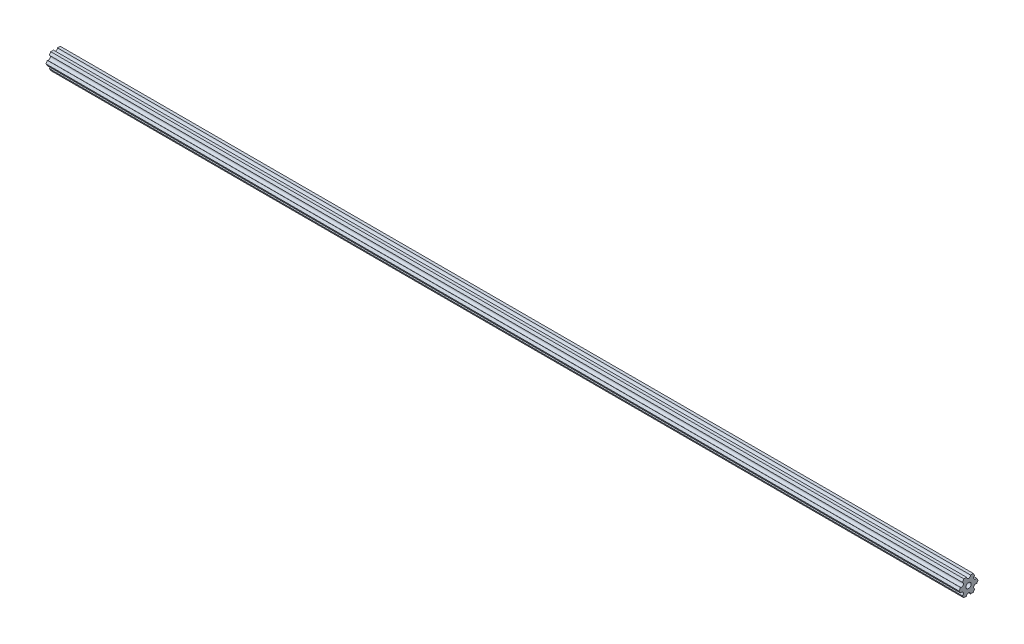
ISO-10303-21;
HEADER;
FILE_DESCRIPTION(('STEP AP214'),'2;1');
FILE_NAME('part.step','',(''),(''),'','','');
FILE_SCHEMA(('AUTOMOTIVE_DESIGN { 1 0 10303 214 1 1 1 1 }'));
ENDSEC;
DATA;
#1=APPLICATION_CONTEXT('core data for automotive mechanical design processes');
#2=APPLICATION_PROTOCOL_DEFINITION('international standard','automotive_design',2000,#1);
#3=PRODUCT_CONTEXT('',#1,'mechanical');
#4=PRODUCT('Part','Part','',(#3));
#5=PRODUCT_RELATED_PRODUCT_CATEGORY('part','',(#4));
#6=PRODUCT_DEFINITION_FORMATION('','',#4);
#7=PRODUCT_DEFINITION_CONTEXT('part definition',#1,'design');
#8=PRODUCT_DEFINITION('design','',#6,#7);
#9=PRODUCT_DEFINITION_SHAPE('','',#8);
#10=(LENGTH_UNIT() NAMED_UNIT(*) SI_UNIT(.MILLI.,.METRE.));
#11=(NAMED_UNIT(*) PLANE_ANGLE_UNIT() SI_UNIT($,.RADIAN.));
#12=(NAMED_UNIT(*) SI_UNIT($,.STERADIAN.) SOLID_ANGLE_UNIT());
#13=UNCERTAINTY_MEASURE_WITH_UNIT(LENGTH_MEASURE(1.E-05),#10,'distance_accuracy_value','');
#14=(GEOMETRIC_REPRESENTATION_CONTEXT(3) GLOBAL_UNCERTAINTY_ASSIGNED_CONTEXT((#13)) GLOBAL_UNIT_ASSIGNED_CONTEXT((#10,
#11,#12)) REPRESENTATION_CONTEXT('',''));
#15=CARTESIAN_POINT('',(0.,0.,0.));
#16=DIRECTION('',(0.,0.,1.));
#17=DIRECTION('',(1.,0.,0.));
#18=AXIS2_PLACEMENT_3D('',#15,#16,#17);
#19=CARTESIAN_POINT('',(714.375,-6.35,-3.66617420935413));
#20=DIRECTION('',(0.,0.5,0.866025403784439));
#21=DIRECTION('',(0.,-0.866025403784439,0.5));
#22=AXIS2_PLACEMENT_3D('',#19,#20,#21);
#23=PLANE('',#22);
#24=DIRECTION('',(0.,0.866025403784439,-0.5));
#25=VECTOR('',#24,1.);
#26=CARTESIAN_POINT('',(708.025,-6.35,-3.66617420935413));
#27=LINE('',#26,#25);
#28=CARTESIAN_POINT('',(708.025,-6.35,-3.66617420935413));
#29=VERTEX_POINT('',#28);
#30=CARTESIAN_POINT('',(708.025,-4.49482271536801,-4.73726131403088));
#31=VERTEX_POINT('',#30);
#32=EDGE_CURVE('E47',#29,#31,#27,.T.);
#33=ORIENTED_EDGE('',*,*,#32,.F.);
#34=DIRECTION('',(-1.,0.,0.));
#35=VECTOR('',#34,1.);
#36=CARTESIAN_POINT('',(714.375,-6.35,-3.66617420935413));
#37=LINE('',#36,#35);
#38=CARTESIAN_POINT('',(0.,-6.35,-3.66617420935413));
#39=VERTEX_POINT('',#38);
#40=EDGE_CURVE('E206',#29,#39,#37,.T.);
#41=ORIENTED_EDGE('',*,*,#40,.T.);
#42=DIRECTION('',(0.,0.866025403784439,-0.5));
#43=VECTOR('',#42,1.);
#44=CARTESIAN_POINT('',(0.,-6.35,-3.66617420935413));
#45=LINE('',#44,#43);
#46=CARTESIAN_POINT('',(0.,-4.49482271536801,-4.73726131403088));
#47=VERTEX_POINT('',#46);
#48=EDGE_CURVE('E228',#39,#47,#45,.T.);
#49=ORIENTED_EDGE('',*,*,#48,.T.);
#50=DIRECTION('',(1.,0.,0.));
#51=VECTOR('',#50,1.);
#52=CARTESIAN_POINT('',(0.,-4.49482271536801,-4.73726131403088));
#53=LINE('',#52,#51);
#54=EDGE_CURVE('E41',#47,#31,#53,.T.);
#55=ORIENTED_EDGE('',*,*,#54,.T.);
#56=EDGE_LOOP('',(#33,#41,#49,#55));
#57=FACE_BOUND('',#56,.T.);
#58=ADVANCED_FACE('F34',(#57),#23,.F.);
#59=CARTESIAN_POINT('',(714.375,0.,-7.33234841870825));
#60=DIRECTION('',(0.,-0.5,0.866025403784439));
#61=DIRECTION('',(0.,-0.866025403784439,-0.5));
#62=AXIS2_PLACEMENT_3D('',#59,#60,#61);
#63=PLANE('',#62);
#64=DIRECTION('',(0.,0.866025403784439,0.5));
#65=VECTOR('',#64,1.);
#66=CARTESIAN_POINT('',(708.025,0.,-7.33234841870825));
#67=LINE('',#66,#65);
#68=CARTESIAN_POINT('',(708.025,0.,-7.33234841870825));
#69=VERTEX_POINT('',#68);
#70=CARTESIAN_POINT('',(708.025,1.85517728463229,-6.26126131403132));
#71=VERTEX_POINT('',#70);
#72=EDGE_CURVE('E164',#69,#71,#67,.T.);
#73=ORIENTED_EDGE('',*,*,#72,.F.);
#74=DIRECTION('',(-1.,0.,0.));
#75=VECTOR('',#74,1.);
#76=CARTESIAN_POINT('',(714.375,0.,-7.33234841870825));
#77=LINE('',#76,#75);
#78=CARTESIAN_POINT('',(0.,0.,-7.33234841870825));
#79=VERTEX_POINT('',#78);
#80=EDGE_CURVE('E163',#69,#79,#77,.T.);
#81=ORIENTED_EDGE('',*,*,#80,.T.);
#82=DIRECTION('',(0.,0.866025403784439,0.5));
#83=VECTOR('',#82,1.);
#84=CARTESIAN_POINT('',(0.,0.,-7.33234841870825));
#85=LINE('',#84,#83);
#86=CARTESIAN_POINT('',(0.,1.85517728463229,-6.26126131403132));
#87=VERTEX_POINT('',#86);
#88=EDGE_CURVE('E224',#79,#87,#85,.T.);
#89=ORIENTED_EDGE('',*,*,#88,.T.);
#90=DIRECTION('',(1.,0.,0.));
#91=VECTOR('',#90,1.);
#92=CARTESIAN_POINT('',(0.,1.85517728463229,-6.26126131403132));
#93=LINE('',#92,#91);
#94=EDGE_CURVE('E170',#87,#71,#93,.T.);
#95=ORIENTED_EDGE('',*,*,#94,.T.);
#96=EDGE_LOOP('',(#73,#81,#89,#95));
#97=FACE_BOUND('',#96,.T.);
#98=ADVANCED_FACE('F290',(#97),#63,.F.);
#99=CARTESIAN_POINT('',(714.375,6.35,-3.66617420935412));
#100=DIRECTION('',(0.,-1.,0.));
#101=DIRECTION('',(0.,0.,-1.));
#102=AXIS2_PLACEMENT_3D('',#99,#100,#101);
#103=PLANE('',#102);
#104=DIRECTION('',(0.,0.,1.));
#105=VECTOR('',#104,1.);
#106=CARTESIAN_POINT('',(708.025,6.35,-3.66617420935412));
#107=LINE('',#106,#105);
#108=CARTESIAN_POINT('',(708.025,6.35,-3.66617420935412));
#109=VERTEX_POINT('',#108);
#110=CARTESIAN_POINT('',(708.025,6.35,-1.524));
#111=VERTEX_POINT('',#110);
#112=EDGE_CURVE('E274',#109,#111,#107,.T.);
#113=ORIENTED_EDGE('',*,*,#112,.F.);
#114=DIRECTION('',(-1.,0.,0.));
#115=VECTOR('',#114,1.);
#116=CARTESIAN_POINT('',(714.375,6.35,-3.66617420935412));
#117=LINE('',#116,#115);
#118=CARTESIAN_POINT('',(0.,6.35,-3.66617420935412));
#119=VERTEX_POINT('',#118);
#120=EDGE_CURVE('E198',#109,#119,#117,.T.);
#121=ORIENTED_EDGE('',*,*,#120,.T.);
#122=DIRECTION('',(0.,0.,1.));
#123=VECTOR('',#122,1.);
#124=CARTESIAN_POINT('',(0.,6.35,-3.66617420935412));
#125=LINE('',#124,#123);
#126=CARTESIAN_POINT('',(0.,6.35,-1.524));
#127=VERTEX_POINT('',#126);
#128=EDGE_CURVE('E220',#119,#127,#125,.T.);
#129=ORIENTED_EDGE('',*,*,#128,.T.);
#130=DIRECTION('',(1.,0.,0.));
#131=VECTOR('',#130,1.);
#132=CARTESIAN_POINT('',(0.,6.35,-1.524));
#133=LINE('',#132,#131);
#134=EDGE_CURVE('E177',#127,#111,#133,.T.);
#135=ORIENTED_EDGE('',*,*,#134,.T.);
#136=EDGE_LOOP('',(#113,#121,#129,#135));
#137=FACE_BOUND('',#136,.T.);
#138=ADVANCED_FACE('F305',(#137),#103,.F.);
#139=CARTESIAN_POINT('',(714.375,6.35,3.66617420935412));
#140=DIRECTION('',(0.,-0.5,-0.866025403784439));
#141=DIRECTION('',(0.,0.866025403784439,-0.5));
#142=AXIS2_PLACEMENT_3D('',#139,#140,#141);
#143=PLANE('',#142);
#144=DIRECTION('',(0.,-0.866025403784439,0.5));
#145=VECTOR('',#144,1.);
#146=CARTESIAN_POINT('',(708.025,6.35,3.66617420935412));
#147=LINE('',#146,#145);
#148=CARTESIAN_POINT('',(708.025,6.35,3.66617420935412));
#149=VERTEX_POINT('',#148);
#150=CARTESIAN_POINT('',(708.025,4.49482271536755,4.73726131403115));
#151=VERTEX_POINT('',#150);
#152=EDGE_CURVE('E264',#149,#151,#147,.T.);
#153=ORIENTED_EDGE('',*,*,#152,.F.);
#154=DIRECTION('',(-1.,0.,0.));
#155=VECTOR('',#154,1.);
#156=CARTESIAN_POINT('',(714.375,6.35,3.66617420935412));
#157=LINE('',#156,#155);
#158=CARTESIAN_POINT('',(0.,6.35,3.66617420935412));
#159=VERTEX_POINT('',#158);
#160=EDGE_CURVE('E200',#149,#159,#157,.T.);
#161=ORIENTED_EDGE('',*,*,#160,.T.);
#162=DIRECTION('',(0.,-0.866025403784439,0.5));
#163=VECTOR('',#162,1.);
#164=CARTESIAN_POINT('',(0.,6.35,3.66617420935412));
#165=LINE('',#164,#163);
#166=CARTESIAN_POINT('',(0.,4.49482271536755,4.73726131403115));
#167=VERTEX_POINT('',#166);
#168=EDGE_CURVE('E216',#159,#167,#165,.T.);
#169=ORIENTED_EDGE('',*,*,#168,.T.);
#170=DIRECTION('',(1.,0.,0.));
#171=VECTOR('',#170,1.);
#172=CARTESIAN_POINT('',(0.,4.49482271536755,4.73726131403115));
#173=LINE('',#172,#171);
#174=EDGE_CURVE('E182',#167,#151,#173,.T.);
#175=ORIENTED_EDGE('',*,*,#174,.T.);
#176=EDGE_LOOP('',(#153,#161,#169,#175));
#177=FACE_BOUND('',#176,.T.);
#178=ADVANCED_FACE('F319',(#177),#143,.F.);
#179=CARTESIAN_POINT('',(714.375,0.,7.33234841870825));
#180=DIRECTION('',(0.,0.5,-0.866025403784439));
#181=DIRECTION('',(0.,0.866025403784439,0.5));
#182=AXIS2_PLACEMENT_3D('',#179,#180,#181);
#183=PLANE('',#182);
#184=DIRECTION('',(0.,-0.866025403784439,-0.5));
#185=VECTOR('',#184,1.);
#186=CARTESIAN_POINT('',(708.025,0.,7.33234841870825));
#187=LINE('',#186,#185);
#188=CARTESIAN_POINT('',(708.025,0.,7.33234841870825));
#189=VERTEX_POINT('',#188);
#190=CARTESIAN_POINT('',(708.025,-1.85517728463215,6.2612613140314));
#191=VERTEX_POINT('',#190);
#192=EDGE_CURVE('E256',#189,#191,#187,.T.);
#193=ORIENTED_EDGE('',*,*,#192,.F.);
#194=DIRECTION('',(-1.,0.,0.));
#195=VECTOR('',#194,1.);
#196=CARTESIAN_POINT('',(714.375,0.,7.33234841870825));
#197=LINE('',#196,#195);
#198=CARTESIAN_POINT('',(0.,0.,7.33234841870825));
#199=VERTEX_POINT('',#198);
#200=EDGE_CURVE('E202',#189,#199,#197,.T.);
#201=ORIENTED_EDGE('',*,*,#200,.T.);
#202=DIRECTION('',(0.,-0.866025403784439,-0.5));
#203=VECTOR('',#202,1.);
#204=CARTESIAN_POINT('',(0.,0.,7.33234841870825));
#205=LINE('',#204,#203);
#206=CARTESIAN_POINT('',(0.,-1.85517728463215,6.2612613140314));
#207=VERTEX_POINT('',#206);
#208=EDGE_CURVE('E212',#199,#207,#205,.T.);
#209=ORIENTED_EDGE('',*,*,#208,.T.);
#210=DIRECTION('',(1.,0.,0.));
#211=VECTOR('',#210,1.);
#212=CARTESIAN_POINT('',(0.,-1.85517728463215,6.2612613140314));
#213=LINE('',#212,#211);
#214=EDGE_CURVE('E187',#207,#191,#213,.T.);
#215=ORIENTED_EDGE('',*,*,#214,.T.);
#216=EDGE_LOOP('',(#193,#201,#209,#215));
#217=FACE_BOUND('',#216,.T.);
#218=ADVANCED_FACE('F334',(#217),#183,.F.);
#219=CARTESIAN_POINT('',(714.375,-6.35,3.66617420935413));
#220=DIRECTION('',(0.,1.,0.));
#221=DIRECTION('',(0.,0.,1.));
#222=AXIS2_PLACEMENT_3D('',#219,#220,#221);
#223=PLANE('',#222);
#224=DIRECTION('',(0.,0.,-1.));
#225=VECTOR('',#224,1.);
#226=CARTESIAN_POINT('',(708.025,-6.35,3.66617420935413));
#227=LINE('',#226,#225);
#228=CARTESIAN_POINT('',(708.025,-6.35,3.66617420935413));
#229=VERTEX_POINT('',#228);
#230=CARTESIAN_POINT('',(708.025,-6.35,1.52400000000069));
#231=VERTEX_POINT('',#230);
#232=EDGE_CURVE('E266',#229,#231,#227,.T.);
#233=ORIENTED_EDGE('',*,*,#232,.F.);
#234=DIRECTION('',(-1.,0.,0.));
#235=VECTOR('',#234,1.);
#236=CARTESIAN_POINT('',(714.375,-6.35,3.66617420935413));
#237=LINE('',#236,#235);
#238=CARTESIAN_POINT('',(0.,-6.35,3.66617420935413));
#239=VERTEX_POINT('',#238);
#240=EDGE_CURVE('E204',#229,#239,#237,.T.);
#241=ORIENTED_EDGE('',*,*,#240,.T.);
#242=DIRECTION('',(0.,0.,-1.));
#243=VECTOR('',#242,1.);
#244=CARTESIAN_POINT('',(0.,-6.35,3.66617420935413));
#245=LINE('',#244,#243);
#246=CARTESIAN_POINT('',(0.,-6.35,1.52400000000069));
#247=VERTEX_POINT('',#246);
#248=EDGE_CURVE('E208',#239,#247,#245,.T.);
#249=ORIENTED_EDGE('',*,*,#248,.T.);
#250=DIRECTION('',(1.,0.,0.));
#251=VECTOR('',#250,1.);
#252=CARTESIAN_POINT('',(0.,-6.35,1.52400000000069));
#253=LINE('',#252,#251);
#254=EDGE_CURVE('E192',#247,#231,#253,.T.);
#255=ORIENTED_EDGE('',*,*,#254,.T.);
#256=EDGE_LOOP('',(#233,#241,#249,#255));
#257=FACE_BOUND('',#256,.T.);
#258=ADVANCED_FACE('F349',(#257),#223,.F.);
#259=DIRECTION('',(0.,0.866025403784439,-0.5));
#260=VECTOR('',#259,1.);
#261=CARTESIAN_POINT('',(708.025,-6.35,-3.66617420935413));
#262=LINE('',#261,#260);
#263=CARTESIAN_POINT('',(708.025,-1.85517728463199,-6.26126131403149));
#264=VERTEX_POINT('',#263);
#265=EDGE_CURVE('E157',#264,#69,#262,.T.);
#266=ORIENTED_EDGE('',*,*,#265,.F.);
#267=DIRECTION('',(1.,0.,0.));
#268=VECTOR('',#267,1.);
#269=CARTESIAN_POINT('',(0.,-1.85517728463199,-6.26126131403149));
#270=LINE('',#269,#268);
#271=CARTESIAN_POINT('',(0.,-1.85517728463199,-6.26126131403149));
#272=VERTEX_POINT('',#271);
#273=EDGE_CURVE('E55',#264,#272,#270,.F.);
#274=ORIENTED_EDGE('',*,*,#273,.T.);
#275=EDGE_CURVE('E231',#272,#79,#45,.T.);
#276=ORIENTED_EDGE('',*,*,#275,.T.);
#277=ORIENTED_EDGE('',*,*,#80,.F.);
#278=EDGE_LOOP('',(#266,#274,#276,#277));
#279=FACE_BOUND('',#278,.T.);
#280=ADVANCED_FACE('F162',(#279),#23,.F.);
#281=DIRECTION('',(0.,0.866025403784439,0.5));
#282=VECTOR('',#281,1.);
#283=CARTESIAN_POINT('',(708.025,0.,-7.33234841870825));
#284=LINE('',#283,#282);
#285=CARTESIAN_POINT('',(708.025,4.49482271536771,-4.73726131403105));
#286=VERTEX_POINT('',#285);
#287=EDGE_CURVE('E276',#286,#109,#284,.T.);
#288=ORIENTED_EDGE('',*,*,#287,.F.);
#289=DIRECTION('',(1.,0.,0.));
#290=VECTOR('',#289,1.);
#291=CARTESIAN_POINT('',(0.,4.49482271536771,-4.73726131403105));
#292=LINE('',#291,#290);
#293=CARTESIAN_POINT('',(0.,4.49482271536771,-4.73726131403105));
#294=VERTEX_POINT('',#293);
#295=EDGE_CURVE('E173',#286,#294,#292,.F.);
#296=ORIENTED_EDGE('',*,*,#295,.T.);
#297=EDGE_CURVE('E227',#294,#119,#85,.T.);
#298=ORIENTED_EDGE('',*,*,#297,.T.);
#299=ORIENTED_EDGE('',*,*,#120,.F.);
#300=EDGE_LOOP('',(#288,#296,#298,#299));
#301=FACE_BOUND('',#300,.T.);
#302=ADVANCED_FACE('F301',(#301),#63,.F.);
#303=DIRECTION('',(0.,0.,1.));
#304=VECTOR('',#303,1.);
#305=CARTESIAN_POINT('',(708.025,6.35,-3.66617420935412));
#306=LINE('',#305,#304);
#307=CARTESIAN_POINT('',(708.025,6.35,1.524));
#308=VERTEX_POINT('',#307);
#309=EDGE_CURVE('E268',#308,#149,#306,.T.);
#310=ORIENTED_EDGE('',*,*,#309,.F.);
#311=DIRECTION('',(1.,0.,0.));
#312=VECTOR('',#311,1.);
#313=CARTESIAN_POINT('',(0.,6.35,1.524));
#314=LINE('',#313,#312);
#315=CARTESIAN_POINT('',(0.,6.35,1.524));
#316=VERTEX_POINT('',#315);
#317=EDGE_CURVE('E180',#308,#316,#314,.F.);
#318=ORIENTED_EDGE('',*,*,#317,.T.);
#319=EDGE_CURVE('E223',#316,#159,#125,.T.);
#320=ORIENTED_EDGE('',*,*,#319,.T.);
#321=ORIENTED_EDGE('',*,*,#160,.F.);
#322=EDGE_LOOP('',(#310,#318,#320,#321));
#323=FACE_BOUND('',#322,.T.);
#324=ADVANCED_FACE('F315',(#323),#103,.F.);
#325=DIRECTION('',(0.,-0.866025403784439,0.5));
#326=VECTOR('',#325,1.);
#327=CARTESIAN_POINT('',(708.025,6.35,3.66617420935412));
#328=LINE('',#327,#326);
#329=CARTESIAN_POINT('',(708.025,1.85517728463244,6.26126131403123));
#330=VERTEX_POINT('',#329);
#331=EDGE_CURVE('E258',#330,#189,#328,.T.);
#332=ORIENTED_EDGE('',*,*,#331,.F.);
#333=DIRECTION('',(1.,0.,0.));
#334=VECTOR('',#333,1.);
#335=CARTESIAN_POINT('',(0.,1.85517728463244,6.26126131403123));
#336=LINE('',#335,#334);
#337=CARTESIAN_POINT('',(0.,1.85517728463244,6.26126131403123));
#338=VERTEX_POINT('',#337);
#339=EDGE_CURVE('E185',#330,#338,#336,.F.);
#340=ORIENTED_EDGE('',*,*,#339,.T.);
#341=EDGE_CURVE('E219',#338,#199,#165,.T.);
#342=ORIENTED_EDGE('',*,*,#341,.T.);
#343=ORIENTED_EDGE('',*,*,#200,.F.);
#344=EDGE_LOOP('',(#332,#340,#342,#343));
#345=FACE_BOUND('',#344,.T.);
#346=ADVANCED_FACE('F330',(#345),#143,.F.);
#347=DIRECTION('',(0.,-0.866025403784439,-0.5));
#348=VECTOR('',#347,1.);
#349=CARTESIAN_POINT('',(708.025,0.,7.33234841870825));
#350=LINE('',#349,#348);
#351=CARTESIAN_POINT('',(708.025,-4.49482271536786,4.73726131403097));
#352=VERTEX_POINT('',#351);
#353=EDGE_CURVE('E260',#352,#229,#350,.T.);
#354=ORIENTED_EDGE('',*,*,#353,.F.);
#355=DIRECTION('',(1.,0.,0.));
#356=VECTOR('',#355,1.);
#357=CARTESIAN_POINT('',(0.,-4.49482271536786,4.73726131403097));
#358=LINE('',#357,#356);
#359=CARTESIAN_POINT('',(0.,-4.49482271536786,4.73726131403097));
#360=VERTEX_POINT('',#359);
#361=EDGE_CURVE('E190',#352,#360,#358,.F.);
#362=ORIENTED_EDGE('',*,*,#361,.T.);
#363=EDGE_CURVE('E215',#360,#239,#205,.T.);
#364=ORIENTED_EDGE('',*,*,#363,.T.);
#365=ORIENTED_EDGE('',*,*,#240,.F.);
#366=EDGE_LOOP('',(#354,#362,#364,#365));
#367=FACE_BOUND('',#366,.T.);
#368=ADVANCED_FACE('F345',(#367),#183,.F.);
#369=DIRECTION('',(0.,0.,-1.));
#370=VECTOR('',#369,1.);
#371=CARTESIAN_POINT('',(708.025,-6.35,3.66617420935413));
#372=LINE('',#371,#370);
#373=CARTESIAN_POINT('',(708.025,-6.35,-1.52400000000069));
#374=VERTEX_POINT('',#373);
#375=EDGE_CURVE('E278',#374,#29,#372,.T.);
#376=ORIENTED_EDGE('',*,*,#375,.F.);
#377=DIRECTION('',(1.,0.,0.));
#378=VECTOR('',#377,1.);
#379=CARTESIAN_POINT('',(0.,-6.35,-1.52400000000069));
#380=LINE('',#379,#378);
#381=CARTESIAN_POINT('',(0.,-6.35,-1.52400000000069));
#382=VERTEX_POINT('',#381);
#383=EDGE_CURVE('E195',#374,#382,#380,.F.);
#384=ORIENTED_EDGE('',*,*,#383,.T.);
#385=EDGE_CURVE('E211',#382,#39,#245,.T.);
#386=ORIENTED_EDGE('',*,*,#385,.T.);
#387=ORIENTED_EDGE('',*,*,#40,.F.);
#388=EDGE_LOOP('',(#376,#384,#386,#387));
#389=FACE_BOUND('',#388,.T.);
#390=ADVANCED_FACE('F360',(#389),#223,.F.);
#391=CARTESIAN_POINT('',(714.375,0.,0.));
#392=DIRECTION('',(-1.,0.,0.));
#393=DIRECTION('',(0.,0.,1.));
#394=AXIS2_PLACEMENT_3D('',#391,#392,#393);
#395=CYLINDRICAL_SURFACE('',#394,2.0193);
#396=CARTESIAN_POINT('',(0.,0.,0.));
#397=DIRECTION('',(1.,0.,0.));
#398=DIRECTION('',(0.,0.,-1.));
#399=AXIS2_PLACEMENT_3D('',#396,#397,#398);
#400=CIRCLE('',#399,2.0193);
#401=CARTESIAN_POINT('',(0.,0.,-2.0193));
#402=VERTEX_POINT('',#401);
#403=EDGE_CURVE('E232',#402,#402,#400,.T.);
#404=ORIENTED_EDGE('',*,*,#403,.F.);
#405=EDGE_LOOP('',(#404));
#406=FACE_BOUND('',#405,.T.);
#407=CARTESIAN_POINT('',(708.025,0.,0.));
#408=DIRECTION('',(1.,0.,0.));
#409=DIRECTION('',(0.,0.,-1.));
#410=AXIS2_PLACEMENT_3D('',#407,#408,#409);
#411=CIRCLE('',#410,2.0193);
#412=CARTESIAN_POINT('',(708.025,0.,-2.0193));
#413=VERTEX_POINT('',#412);
#414=EDGE_CURVE('E249',#413,#413,#411,.T.);
#415=ORIENTED_EDGE('',*,*,#414,.T.);
#416=EDGE_LOOP('',(#415));
#417=FACE_BOUND('',#416,.T.);
#418=ADVANCED_FACE('F379',(#406,#417),#395,.F.);
#419=CARTESIAN_POINT('',(0.,-6.35,0.));
#420=DIRECTION('',(1.,0.,0.));
#421=DIRECTION('',(0.,0.,-1.));
#422=AXIS2_PLACEMENT_3D('',#419,#420,#421);
#423=CYLINDRICAL_SURFACE('',#422,1.52400000000069);
#424=CARTESIAN_POINT('',(708.025,-6.35,0.));
#425=DIRECTION('',(1.,0.,0.));
#426=DIRECTION('',(0.,0.,-1.));
#427=AXIS2_PLACEMENT_3D('',#424,#425,#426);
#428=CIRCLE('',#427,1.52400000000069);
#429=EDGE_CURVE('E270',#231,#374,#428,.F.);
#430=ORIENTED_EDGE('',*,*,#429,.F.);
#431=ORIENTED_EDGE('',*,*,#254,.F.);
#432=CARTESIAN_POINT('',(0.,-6.35,0.));
#433=DIRECTION('',(1.,0.,0.));
#434=DIRECTION('',(0.,0.,-1.));
#435=AXIS2_PLACEMENT_3D('',#432,#433,#434);
#436=CIRCLE('',#435,1.52400000000069);
#437=EDGE_CURVE('E239',#382,#247,#436,.T.);
#438=ORIENTED_EDGE('',*,*,#437,.F.);
#439=ORIENTED_EDGE('',*,*,#383,.F.);
#440=EDGE_LOOP('',(#430,#431,#438,#439));
#441=FACE_BOUND('',#440,.T.);
#442=ADVANCED_FACE('F352',(#441),#423,.F.);
#443=CARTESIAN_POINT('',(0.,-3.175,5.49926131403119));
#444=DIRECTION('',(1.,0.,0.));
#445=DIRECTION('',(0.,0.,-1.));
#446=AXIS2_PLACEMENT_3D('',#443,#444,#445);
#447=CYLINDRICAL_SURFACE('',#446,1.52400000000042);
#448=CARTESIAN_POINT('',(708.025,-3.175,5.49926131403119));
#449=DIRECTION('',(1.,0.,0.));
#450=DIRECTION('',(0.,0.,-1.));
#451=AXIS2_PLACEMENT_3D('',#448,#449,#450);
#452=CIRCLE('',#451,1.52400000000042);
#453=EDGE_CURVE('E254',#191,#352,#452,.F.);
#454=ORIENTED_EDGE('',*,*,#453,.F.);
#455=ORIENTED_EDGE('',*,*,#214,.F.);
#456=CARTESIAN_POINT('',(0.,-3.175,5.49926131403119));
#457=DIRECTION('',(1.,0.,0.));
#458=DIRECTION('',(0.,0.,-1.));
#459=AXIS2_PLACEMENT_3D('',#456,#457,#458);
#460=CIRCLE('',#459,1.52400000000042);
#461=EDGE_CURVE('E236',#360,#207,#460,.T.);
#462=ORIENTED_EDGE('',*,*,#461,.F.);
#463=ORIENTED_EDGE('',*,*,#361,.F.);
#464=EDGE_LOOP('',(#454,#455,#462,#463));
#465=FACE_BOUND('',#464,.T.);
#466=ADVANCED_FACE('F337',(#465),#447,.F.);
#467=CARTESIAN_POINT('',(0.,3.175,5.49926131403119));
#468=DIRECTION('',(1.,0.,0.));
#469=DIRECTION('',(0.,0.,-1.));
#470=AXIS2_PLACEMENT_3D('',#467,#468,#469);
#471=CYLINDRICAL_SURFACE('',#470,1.52400000000008);
#472=CARTESIAN_POINT('',(708.025,3.175,5.49926131403119));
#473=DIRECTION('',(1.,0.,0.));
#474=DIRECTION('',(0.,0.,-1.));
#475=AXIS2_PLACEMENT_3D('',#472,#473,#474);
#476=CIRCLE('',#475,1.52400000000008);
#477=EDGE_CURVE('E262',#151,#330,#476,.F.);
#478=ORIENTED_EDGE('',*,*,#477,.F.);
#479=ORIENTED_EDGE('',*,*,#174,.F.);
#480=CARTESIAN_POINT('',(0.,3.175,5.49926131403119));
#481=DIRECTION('',(1.,0.,0.));
#482=DIRECTION('',(0.,0.,-1.));
#483=AXIS2_PLACEMENT_3D('',#480,#481,#482);
#484=CIRCLE('',#483,1.52400000000008);
#485=EDGE_CURVE('E240',#338,#167,#484,.T.);
#486=ORIENTED_EDGE('',*,*,#485,.F.);
#487=ORIENTED_EDGE('',*,*,#339,.F.);
#488=EDGE_LOOP('',(#478,#479,#486,#487));
#489=FACE_BOUND('',#488,.T.);
#490=ADVANCED_FACE('F322',(#489),#471,.F.);
#491=CARTESIAN_POINT('',(0.,6.35,0.));
#492=DIRECTION('',(1.,0.,0.));
#493=DIRECTION('',(0.,0.,-1.));
#494=AXIS2_PLACEMENT_3D('',#491,#492,#493);
#495=CYLINDRICAL_SURFACE('',#494,1.524);
#496=CARTESIAN_POINT('',(708.025,6.35,0.));
#497=DIRECTION('',(1.,0.,0.));
#498=DIRECTION('',(0.,0.,-1.));
#499=AXIS2_PLACEMENT_3D('',#496,#497,#498);
#500=CIRCLE('',#499,1.524);
#501=EDGE_CURVE('E272',#111,#308,#500,.F.);
#502=ORIENTED_EDGE('',*,*,#501,.F.);
#503=ORIENTED_EDGE('',*,*,#134,.F.);
#504=CARTESIAN_POINT('',(0.,6.35,0.));
#505=DIRECTION('',(1.,0.,0.));
#506=DIRECTION('',(0.,0.,-1.));
#507=AXIS2_PLACEMENT_3D('',#504,#505,#506);
#508=CIRCLE('',#507,1.524);
#509=EDGE_CURVE('E235',#316,#127,#508,.T.);
#510=ORIENTED_EDGE('',*,*,#509,.F.);
#511=ORIENTED_EDGE('',*,*,#317,.F.);
#512=EDGE_LOOP('',(#502,#503,#510,#511));
#513=FACE_BOUND('',#512,.T.);
#514=ADVANCED_FACE('F308',(#513),#495,.F.);
#515=CARTESIAN_POINT('',(0.,3.175,-5.49926131403119));
#516=DIRECTION('',(1.,0.,0.));
#517=DIRECTION('',(0.,0.,-1.));
#518=AXIS2_PLACEMENT_3D('',#515,#516,#517);
#519=CYLINDRICAL_SURFACE('',#518,1.52400000000026);
#520=CARTESIAN_POINT('',(708.025,3.175,-5.49926131403119));
#521=DIRECTION('',(1.,0.,0.));
#522=DIRECTION('',(0.,0.,-1.));
#523=AXIS2_PLACEMENT_3D('',#520,#521,#522);
#524=CIRCLE('',#523,1.52400000000026);
#525=EDGE_CURVE('E280',#71,#286,#524,.F.);
#526=ORIENTED_EDGE('',*,*,#525,.F.);
#527=ORIENTED_EDGE('',*,*,#94,.F.);
#528=CARTESIAN_POINT('',(0.,3.175,-5.49926131403119));
#529=DIRECTION('',(1.,0.,0.));
#530=DIRECTION('',(0.,0.,-1.));
#531=AXIS2_PLACEMENT_3D('',#528,#529,#530);
#532=CIRCLE('',#531,1.52400000000026);
#533=EDGE_CURVE('E244',#294,#87,#532,.T.);
#534=ORIENTED_EDGE('',*,*,#533,.F.);
#535=ORIENTED_EDGE('',*,*,#295,.F.);
#536=EDGE_LOOP('',(#526,#527,#534,#535));
#537=FACE_BOUND('',#536,.T.);
#538=ADVANCED_FACE('F288',(#537),#519,.F.);
#539=CARTESIAN_POINT('',(0.,-3.175,-5.49926131403119));
#540=DIRECTION('',(1.,0.,0.));
#541=DIRECTION('',(0.,0.,-1.));
#542=AXIS2_PLACEMENT_3D('',#539,#540,#541);
#543=CYLINDRICAL_SURFACE('',#542,1.52400000000061);
#544=CARTESIAN_POINT('',(708.025,-3.175,-5.49926131403119));
#545=DIRECTION('',(1.,0.,0.));
#546=DIRECTION('',(0.,0.,-1.));
#547=AXIS2_PLACEMENT_3D('',#544,#545,#546);
#548=CIRCLE('',#547,1.52400000000061);
#549=EDGE_CURVE('E11',#31,#264,#548,.F.);
#550=ORIENTED_EDGE('',*,*,#549,.F.);
#551=ORIENTED_EDGE('',*,*,#54,.F.);
#552=CARTESIAN_POINT('',(0.,-3.175,-5.49926131403119));
#553=DIRECTION('',(1.,0.,0.));
#554=DIRECTION('',(0.,0.,-1.));
#555=AXIS2_PLACEMENT_3D('',#552,#553,#554);
#556=CIRCLE('',#555,1.52400000000061);
#557=EDGE_CURVE('E168',#272,#47,#556,.T.);
#558=ORIENTED_EDGE('',*,*,#557,.F.);
#559=ORIENTED_EDGE('',*,*,#273,.F.);
#560=EDGE_LOOP('',(#550,#551,#558,#559));
#561=FACE_BOUND('',#560,.T.);
#562=ADVANCED_FACE('F166',(#561),#543,.F.);
#563=CARTESIAN_POINT('',(0.,0.,0.));
#564=DIRECTION('',(1.,0.,0.));
#565=DIRECTION('',(0.,0.,-1.));
#566=AXIS2_PLACEMENT_3D('',#563,#564,#565);
#567=PLANE('',#566);
#568=ORIENTED_EDGE('',*,*,#319,.F.);
#569=ORIENTED_EDGE('',*,*,#509,.T.);
#570=ORIENTED_EDGE('',*,*,#128,.F.);
#571=ORIENTED_EDGE('',*,*,#297,.F.);
#572=ORIENTED_EDGE('',*,*,#533,.T.);
#573=ORIENTED_EDGE('',*,*,#88,.F.);
#574=ORIENTED_EDGE('',*,*,#275,.F.);
#575=ORIENTED_EDGE('',*,*,#557,.T.);
#576=ORIENTED_EDGE('',*,*,#48,.F.);
#577=ORIENTED_EDGE('',*,*,#385,.F.);
#578=ORIENTED_EDGE('',*,*,#437,.T.);
#579=ORIENTED_EDGE('',*,*,#248,.F.);
#580=ORIENTED_EDGE('',*,*,#363,.F.);
#581=ORIENTED_EDGE('',*,*,#461,.T.);
#582=ORIENTED_EDGE('',*,*,#208,.F.);
#583=ORIENTED_EDGE('',*,*,#341,.F.);
#584=ORIENTED_EDGE('',*,*,#485,.T.);
#585=ORIENTED_EDGE('',*,*,#168,.F.);
#586=EDGE_LOOP('',(#568,#569,#570,#571,#572,#573,#574,#575,#576,#577,#578,#579,#580,#581,#582,
#583,#584,#585));
#587=FACE_BOUND('',#586,.T.);
#588=ORIENTED_EDGE('',*,*,#403,.T.);
#589=EDGE_LOOP('',(#588));
#590=FACE_BOUND('',#589,.T.);
#591=ADVANCED_FACE('F294',(#587,#590),#567,.F.);
#592=CARTESIAN_POINT('',(708.025,0.,0.));
#593=DIRECTION('',(1.,0.,0.));
#594=DIRECTION('',(0.,0.,-1.));
#595=AXIS2_PLACEMENT_3D('',#592,#593,#594);
#596=PLANE('',#595);
#597=ORIENTED_EDGE('',*,*,#414,.F.);
#598=EDGE_LOOP('',(#597));
#599=FACE_BOUND('',#598,.T.);
#600=ORIENTED_EDGE('',*,*,#453,.T.);
#601=ORIENTED_EDGE('',*,*,#353,.T.);
#602=ORIENTED_EDGE('',*,*,#232,.T.);
#603=ORIENTED_EDGE('',*,*,#429,.T.);
#604=ORIENTED_EDGE('',*,*,#375,.T.);
#605=ORIENTED_EDGE('',*,*,#32,.T.);
#606=ORIENTED_EDGE('',*,*,#549,.T.);
#607=ORIENTED_EDGE('',*,*,#265,.T.);
#608=ORIENTED_EDGE('',*,*,#72,.T.);
#609=ORIENTED_EDGE('',*,*,#525,.T.);
#610=ORIENTED_EDGE('',*,*,#287,.T.);
#611=ORIENTED_EDGE('',*,*,#112,.T.);
#612=ORIENTED_EDGE('',*,*,#501,.T.);
#613=ORIENTED_EDGE('',*,*,#309,.T.);
#614=ORIENTED_EDGE('',*,*,#152,.T.);
#615=ORIENTED_EDGE('',*,*,#477,.T.);
#616=ORIENTED_EDGE('',*,*,#331,.T.);
#617=ORIENTED_EDGE('',*,*,#192,.T.);
#618=EDGE_LOOP('',(#600,#601,#602,#603,#604,#605,#606,#607,#608,#609,#610,#611,#612,#613,#614,
#615,#616,#617));
#619=FACE_BOUND('',#618,.T.);
#620=ADVANCED_FACE('F156',(#599,#619),#596,.T.);
#621=CLOSED_SHELL('',(#58,#98,#138,#178,#218,#258,#280,#302,#324,#346,#368,#390,#418,#442,#466,
#490,#514,#538,#562,#591,#620));
#622=MANIFOLD_SOLID_BREP('B2',#621);
#623=ADVANCED_BREP_SHAPE_REPRESENTATION('',(#18,#622),#14);
#624=SHAPE_DEFINITION_REPRESENTATION(#9,#623);
ENDSEC;
END-ISO-10303-21;
